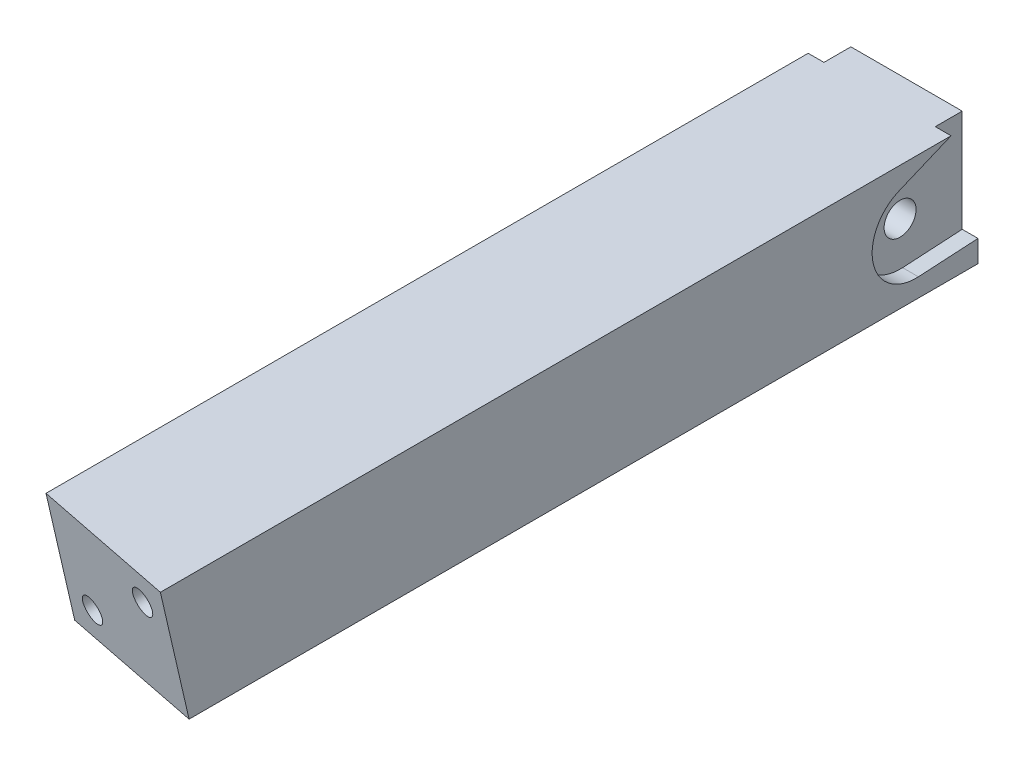
ISO-10303-21;
HEADER;
FILE_DESCRIPTION(('STEP AP214'),'2;1');
FILE_NAME('part.step','',(''),(''),'','','');
FILE_SCHEMA(('AUTOMOTIVE_DESIGN { 1 0 10303 214 1 1 1 1 }'));
ENDSEC;
DATA;
#1=APPLICATION_CONTEXT('core data for automotive mechanical design processes');
#2=APPLICATION_PROTOCOL_DEFINITION('international standard','automotive_design',2000,#1);
#3=PRODUCT_CONTEXT('',#1,'mechanical');
#4=PRODUCT('Part','Part','',(#3));
#5=PRODUCT_RELATED_PRODUCT_CATEGORY('part','',(#4));
#6=PRODUCT_DEFINITION_FORMATION('','',#4);
#7=PRODUCT_DEFINITION_CONTEXT('part definition',#1,'design');
#8=PRODUCT_DEFINITION('design','',#6,#7);
#9=PRODUCT_DEFINITION_SHAPE('','',#8);
#10=(LENGTH_UNIT() NAMED_UNIT(*) SI_UNIT(.MILLI.,.METRE.));
#11=(NAMED_UNIT(*) PLANE_ANGLE_UNIT() SI_UNIT($,.RADIAN.));
#12=(NAMED_UNIT(*) SI_UNIT($,.STERADIAN.) SOLID_ANGLE_UNIT());
#13=UNCERTAINTY_MEASURE_WITH_UNIT(LENGTH_MEASURE(1.E-05),#10,'distance_accuracy_value','');
#14=(GEOMETRIC_REPRESENTATION_CONTEXT(3) GLOBAL_UNCERTAINTY_ASSIGNED_CONTEXT((#13)) GLOBAL_UNIT_ASSIGNED_CONTEXT((#10,
#11,#12)) REPRESENTATION_CONTEXT('',''));
#15=CARTESIAN_POINT('',(0.,0.,0.));
#16=DIRECTION('',(0.,0.,1.));
#17=DIRECTION('',(1.,0.,0.));
#18=AXIS2_PLACEMENT_3D('',#15,#16,#17);
#19=CARTESIAN_POINT('',(-14.605,-12.7,188.173587081889));
#20=DIRECTION('',(-1.,0.,0.));
#21=DIRECTION('',(0.,0.,-1.));
#22=AXIS2_PLACEMENT_3D('',#19,#20,#21);
#23=PLANE('',#22);
#24=CARTESIAN_POINT('',(-14.605,0.,0.));
#25=DIRECTION('',(1.,0.,0.));
#26=DIRECTION('',(0.,0.,-1.));
#27=AXIS2_PLACEMENT_3D('',#24,#25,#26);
#28=CIRCLE('',#27,8.9408);
#29=CARTESIAN_POINT('',(-14.605,8.24835061759198,3.45001691724403));
#30=VERTEX_POINT('',#29);
#31=CARTESIAN_POINT('',(-14.605,-8.92595629933371,-0.51498425450186));
#32=VERTEX_POINT('',#31);
#33=EDGE_CURVE('E137',#30,#32,#28,.T.);
#34=ORIENTED_EDGE('',*,*,#33,.T.);
#35=DIRECTION('',(0.,0.0575993484365894,-0.998339779363559));
#36=VECTOR('',#35,1.);
#37=CARTESIAN_POINT('',(-14.605,-19.7887723133867,187.764599405642));
#38=LINE('',#37,#36);
#39=CARTESIAN_POINT('',(-14.605,-8.22294016981746,-12.7));
#40=VERTEX_POINT('',#39);
#41=EDGE_CURVE('E239',#32,#40,#38,.T.);
#42=ORIENTED_EDGE('',*,*,#41,.T.);
#43=DIRECTION('',(0.,-1.,0.));
#44=VECTOR('',#43,1.);
#45=CARTESIAN_POINT('',(-14.605,-12.7,-12.7));
#46=LINE('',#45,#44);
#47=CARTESIAN_POINT('',(-14.605,-12.7,-12.7));
#48=VERTEX_POINT('',#47);
#49=EDGE_CURVE('E202',#40,#48,#46,.T.);
#50=ORIENTED_EDGE('',*,*,#49,.T.);
#51=DIRECTION('',(0.,0.,-1.));
#52=VECTOR('',#51,1.);
#53=CARTESIAN_POINT('',(-14.605,-12.7,188.173587081889));
#54=LINE('',#53,#52);
#55=CARTESIAN_POINT('',(-14.605,-12.7,142.734728784824));
#56=VERTEX_POINT('',#55);
#57=EDGE_CURVE('E217',#56,#48,#54,.T.);
#58=ORIENTED_EDGE('',*,*,#57,.F.);
#59=DIRECTION('',(0.,-0.974345757792195,-0.225056313558081));
#60=VECTOR('',#59,1.);
#61=CARTESIAN_POINT('',(-14.605,-2.73604608624946,145.036222600913));
#62=LINE('',#61,#60);
#63=CARTESIAN_POINT('',(-14.605,12.7,148.601671108592));
#64=VERTEX_POINT('',#63);
#65=EDGE_CURVE('E218',#64,#56,#62,.T.);
#66=ORIENTED_EDGE('',*,*,#65,.F.);
#67=DIRECTION('',(0.,0.,-1.));
#68=VECTOR('',#67,1.);
#69=CARTESIAN_POINT('',(-14.605,12.7,188.173587081889));
#70=LINE('',#69,#68);
#71=CARTESIAN_POINT('',(-14.605,12.7,-7.19305116429456));
#72=VERTEX_POINT('',#71);
#73=EDGE_CURVE('E209',#64,#72,#70,.T.);
#74=ORIENTED_EDGE('',*,*,#73,.T.);
#75=DIRECTION('',(0.,0.385873402519241,-0.922551742304042));
#76=VECTOR('',#75,1.);
#77=CARTESIAN_POINT('',(-14.605,-60.6302303258765,168.125929903131));
#78=LINE('',#77,#76);
#79=EDGE_CURVE('E49',#30,#72,#78,.T.);
#80=ORIENTED_EDGE('',*,*,#79,.F.);
#81=EDGE_LOOP('',(#34,#42,#50,#58,#66,#74,#80));
#82=FACE_BOUND('',#81,.T.);
#83=ADVANCED_FACE('F41',(#82),#23,.T.);
#84=CARTESIAN_POINT('',(14.605,-12.7,188.173587081889));
#85=DIRECTION('',(1.,0.,0.));
#86=DIRECTION('',(0.,0.,1.));
#87=AXIS2_PLACEMENT_3D('',#84,#85,#86);
#88=PLANE('',#87);
#89=DIRECTION('',(0.,0.385873402519241,-0.922551742304042));
#90=VECTOR('',#89,1.);
#91=CARTESIAN_POINT('',(14.605,-60.6302303258765,168.125929903131));
#92=LINE('',#91,#90);
#93=CARTESIAN_POINT('',(14.605,8.24835061759198,3.45001691724403));
#94=VERTEX_POINT('',#93);
#95=CARTESIAN_POINT('',(14.605,12.7,-7.19305116429456));
#96=VERTEX_POINT('',#95);
#97=EDGE_CURVE('E236',#94,#96,#92,.T.);
#98=ORIENTED_EDGE('',*,*,#97,.T.);
#99=DIRECTION('',(0.,0.,-1.));
#100=VECTOR('',#99,1.);
#101=CARTESIAN_POINT('',(14.605,12.7,188.173587081889));
#102=LINE('',#101,#100);
#103=CARTESIAN_POINT('',(14.605,12.7,154.431187167313));
#104=VERTEX_POINT('',#103);
#105=EDGE_CURVE('E213',#104,#96,#102,.T.);
#106=ORIENTED_EDGE('',*,*,#105,.F.);
#107=DIRECTION('',(0.,0.974345757792195,0.225056313558081));
#108=VECTOR('',#107,1.);
#109=CARTESIAN_POINT('',(14.605,-4.0143578996497,150.570471664318));
#110=LINE('',#109,#108);
#111=CARTESIAN_POINT('',(14.605,-12.7,148.564244843544));
#112=VERTEX_POINT('',#111);
#113=EDGE_CURVE('E210',#112,#104,#110,.T.);
#114=ORIENTED_EDGE('',*,*,#113,.F.);
#115=DIRECTION('',(0.,0.,-1.));
#116=VECTOR('',#115,1.);
#117=CARTESIAN_POINT('',(14.605,-12.7,188.173587081889));
#118=LINE('',#117,#116);
#119=CARTESIAN_POINT('',(14.605,-12.7,-12.7));
#120=VERTEX_POINT('',#119);
#121=EDGE_CURVE('E214',#112,#120,#118,.T.);
#122=ORIENTED_EDGE('',*,*,#121,.T.);
#123=DIRECTION('',(0.,1.,0.));
#124=VECTOR('',#123,1.);
#125=CARTESIAN_POINT('',(14.605,-12.7,-12.7));
#126=LINE('',#125,#124);
#127=CARTESIAN_POINT('',(14.605,-8.22294016981746,-12.7));
#128=VERTEX_POINT('',#127);
#129=EDGE_CURVE('E189',#120,#128,#126,.T.);
#130=ORIENTED_EDGE('',*,*,#129,.T.);
#131=DIRECTION('',(0.,0.0575993484365893,-0.998339779363559));
#132=VECTOR('',#131,1.);
#133=CARTESIAN_POINT('',(14.605,-19.7887723133867,187.764599405642));
#134=LINE('',#133,#132);
#135=CARTESIAN_POINT('',(14.605,-8.92595629933371,-0.514984254501856));
#136=VERTEX_POINT('',#135);
#137=EDGE_CURVE('E180',#136,#128,#134,.T.);
#138=ORIENTED_EDGE('',*,*,#137,.F.);
#139=CARTESIAN_POINT('',(14.605,0.,0.));
#140=DIRECTION('',(-1.,0.,0.));
#141=DIRECTION('',(0.,0.,1.));
#142=AXIS2_PLACEMENT_3D('',#139,#140,#141);
#143=CIRCLE('',#142,8.9408);
#144=EDGE_CURVE('E233',#94,#136,#143,.F.);
#145=ORIENTED_EDGE('',*,*,#144,.F.);
#146=EDGE_LOOP('',(#98,#106,#114,#122,#130,#138,#145));
#147=FACE_BOUND('',#146,.T.);
#148=ADVANCED_FACE('F263',(#147),#88,.T.);
#149=CARTESIAN_POINT('',(0.,0.,-12.7));
#150=DIRECTION('',(0.,0.,1.));
#151=DIRECTION('',(-1.,0.,0.));
#152=AXIS2_PLACEMENT_3D('',#149,#150,#151);
#153=PLANE('',#152);
#154=DIRECTION('',(-1.,0.,0.));
#155=VECTOR('',#154,1.);
#156=CARTESIAN_POINT('',(-14.605,12.7,-12.7));
#157=LINE('',#156,#155);
#158=CARTESIAN_POINT('',(11.3792,12.7,-12.7));
#159=VERTEX_POINT('',#158);
#160=CARTESIAN_POINT('',(-11.3792,12.7,-12.7));
#161=VERTEX_POINT('',#160);
#162=EDGE_CURVE('E200',#159,#161,#157,.T.);
#163=ORIENTED_EDGE('',*,*,#162,.F.);
#164=DIRECTION('',(0.,-1.,0.));
#165=VECTOR('',#164,1.);
#166=CARTESIAN_POINT('',(11.3792,0.,-12.7));
#167=LINE('',#166,#165);
#168=CARTESIAN_POINT('',(11.3792,-8.22294016981746,-12.7));
#169=VERTEX_POINT('',#168);
#170=EDGE_CURVE('E176',#159,#169,#167,.T.);
#171=ORIENTED_EDGE('',*,*,#170,.T.);
#172=DIRECTION('',(1.,0.,0.));
#173=VECTOR('',#172,1.);
#174=CARTESIAN_POINT('',(0.,-8.22294016981746,-12.7));
#175=LINE('',#174,#173);
#176=EDGE_CURVE('E229',#169,#128,#175,.T.);
#177=ORIENTED_EDGE('',*,*,#176,.T.);
#178=ORIENTED_EDGE('',*,*,#129,.F.);
#179=DIRECTION('',(1.,0.,0.));
#180=VECTOR('',#179,1.);
#181=CARTESIAN_POINT('',(-14.605,-12.7,-12.7));
#182=LINE('',#181,#180);
#183=EDGE_CURVE('E205',#48,#120,#182,.T.);
#184=ORIENTED_EDGE('',*,*,#183,.F.);
#185=ORIENTED_EDGE('',*,*,#49,.F.);
#186=DIRECTION('',(-1.,0.,0.));
#187=VECTOR('',#186,1.);
#188=CARTESIAN_POINT('',(0.,-8.22294016981746,-12.7));
#189=LINE('',#188,#187);
#190=CARTESIAN_POINT('',(-11.3792,-8.22294016981746,-12.7));
#191=VERTEX_POINT('',#190);
#192=EDGE_CURVE('E156',#191,#40,#189,.T.);
#193=ORIENTED_EDGE('',*,*,#192,.F.);
#194=DIRECTION('',(0.,-1.,0.));
#195=VECTOR('',#194,1.);
#196=CARTESIAN_POINT('',(-11.3792,0.,-12.7));
#197=LINE('',#196,#195);
#198=EDGE_CURVE('E159',#161,#191,#197,.T.);
#199=ORIENTED_EDGE('',*,*,#198,.F.);
#200=EDGE_LOOP('',(#163,#171,#177,#178,#184,#185,#193,#199));
#201=FACE_BOUND('',#200,.T.);
#202=ADVANCED_FACE('F251',(#201),#153,.F.);
#203=CARTESIAN_POINT('',(-14.605,0.,0.));
#204=DIRECTION('',(1.,0.,0.));
#205=DIRECTION('',(0.,0.,1.));
#206=AXIS2_PLACEMENT_3D('',#203,#204,#205);
#207=CYLINDRICAL_SURFACE('',#206,3.2639);
#208=CARTESIAN_POINT('',(-11.3792,0.,0.));
#209=DIRECTION('',(-1.,0.,0.));
#210=DIRECTION('',(0.,0.,1.));
#211=AXIS2_PLACEMENT_3D('',#208,#209,#210);
#212=CIRCLE('',#211,3.2639);
#213=CARTESIAN_POINT('',(-11.3792,0.,3.2639));
#214=VERTEX_POINT('',#213);
#215=EDGE_CURVE('E161',#214,#214,#212,.F.);
#216=ORIENTED_EDGE('',*,*,#215,.F.);
#217=EDGE_LOOP('',(#216));
#218=FACE_BOUND('',#217,.T.);
#219=CARTESIAN_POINT('',(11.3792,0.,0.));
#220=DIRECTION('',(-1.,0.,0.));
#221=DIRECTION('',(0.,0.,1.));
#222=AXIS2_PLACEMENT_3D('',#219,#220,#221);
#223=CIRCLE('',#222,3.2639);
#224=CARTESIAN_POINT('',(11.3792,0.,3.2639));
#225=VERTEX_POINT('',#224);
#226=EDGE_CURVE('E170',#225,#225,#223,.F.);
#227=ORIENTED_EDGE('',*,*,#226,.T.);
#228=EDGE_LOOP('',(#227));
#229=FACE_BOUND('',#228,.T.);
#230=ADVANCED_FACE('F303',(#218,#229),#207,.F.);
#231=CARTESIAN_POINT('',(-362.881468767956,-840.395664617597,-117.954501012968));
#232=DIRECTION('',(-0.190877495960602,-0.220918397975017,0.956431305934704));
#233=DIRECTION('',(0.,0.974345757792195,0.225056313558081));
#234=AXIS2_PLACEMENT_3D('',#231,#232,#233);
#235=PLANE('',#234);
#236=CARTESIAN_POINT('',(-8.22450987228349,-6.36060008000148,145.472387032501));
#237=DIRECTION('',(0.190877495960602,0.220918397975017,-0.956431305934704));
#238=DIRECTION('',(0.,0.974345757792195,0.225056313558081));
#239=AXIS2_PLACEMENT_3D('',#236,#237,#238);
#240=CIRCLE('',#239,2.52730000000012);
#241=CARTESIAN_POINT('',(-8.22450987228349,-3.89813604633315,146.041171853757));
#242=VERTEX_POINT('',#241);
#243=EDGE_CURVE('E190',#242,#242,#240,.T.);
#244=ORIENTED_EDGE('',*,*,#243,.T.);
#245=EDGE_LOOP('',(#244));
#246=FACE_BOUND('',#245,.T.);
#247=CARTESIAN_POINT('',(8.22450987228347,6.36060008000145,151.693528919635));
#248=DIRECTION('',(0.190877495960602,0.220918397975017,-0.956431305934704));
#249=DIRECTION('',(0.,0.974345757792195,0.225056313558081));
#250=AXIS2_PLACEMENT_3D('',#247,#248,#249);
#251=CIRCLE('',#250,2.52730000000013);
#252=CARTESIAN_POINT('',(8.22450987228347,8.82306411366979,152.262313740891));
#253=VERTEX_POINT('',#252);
#254=EDGE_CURVE('E193',#253,#253,#251,.T.);
#255=ORIENTED_EDGE('',*,*,#254,.T.);
#256=EDGE_LOOP('',(#255));
#257=FACE_BOUND('',#256,.T.);
#258=ORIENTED_EDGE('',*,*,#113,.T.);
#259=DIRECTION('',(-0.980661193019829,0.,-0.195713117866241));
#260=VECTOR('',#259,1.);
#261=CARTESIAN_POINT('',(-7.01003103597834,12.7,150.117418918974));
#262=LINE('',#261,#260);
#263=EDGE_CURVE('E207',#104,#64,#262,.T.);
#264=ORIENTED_EDGE('',*,*,#263,.T.);
#265=ORIENTED_EDGE('',*,*,#65,.T.);
#266=DIRECTION('',(0.980661193019829,0.,0.195713117866241));
#267=VECTOR('',#266,1.);
#268=CARTESIAN_POINT('',(-5.88399900627334,-12.7,144.475201750967));
#269=LINE('',#268,#267);
#270=EDGE_CURVE('E215',#56,#112,#269,.T.);
#271=ORIENTED_EDGE('',*,*,#270,.T.);
#272=EDGE_LOOP('',(#258,#264,#265,#271));
#273=FACE_BOUND('',#272,.T.);
#274=ADVANCED_FACE('F43',(#246,#257,#273),#235,.T.);
#275=CARTESIAN_POINT('',(-14.605,12.7,188.173587081889));
#276=DIRECTION('',(0.,1.,0.));
#277=DIRECTION('',(0.,0.,-1.));
#278=AXIS2_PLACEMENT_3D('',#275,#276,#277);
#279=PLANE('',#278);
#280=DIRECTION('',(0.,0.,1.));
#281=VECTOR('',#280,1.);
#282=CARTESIAN_POINT('',(-11.3792,12.7,188.173587081889));
#283=LINE('',#282,#281);
#284=CARTESIAN_POINT('',(-11.3792,12.7,-7.19305116429456));
#285=VERTEX_POINT('',#284);
#286=EDGE_CURVE('E11',#161,#285,#283,.T.);
#287=ORIENTED_EDGE('',*,*,#286,.T.);
#288=DIRECTION('',(1.,0.,0.));
#289=VECTOR('',#288,1.);
#290=CARTESIAN_POINT('',(-14.605,12.7,-7.19305116429456));
#291=LINE('',#290,#289);
#292=EDGE_CURVE('E145',#72,#285,#291,.T.);
#293=ORIENTED_EDGE('',*,*,#292,.F.);
#294=ORIENTED_EDGE('',*,*,#73,.F.);
#295=ORIENTED_EDGE('',*,*,#263,.F.);
#296=ORIENTED_EDGE('',*,*,#105,.T.);
#297=DIRECTION('',(-1.,0.,0.));
#298=VECTOR('',#297,1.);
#299=CARTESIAN_POINT('',(-14.605,12.7,-7.19305116429458));
#300=LINE('',#299,#298);
#301=CARTESIAN_POINT('',(11.3792,12.7,-7.19305116429462));
#302=VERTEX_POINT('',#301);
#303=EDGE_CURVE('E183',#96,#302,#300,.T.);
#304=ORIENTED_EDGE('',*,*,#303,.T.);
#305=DIRECTION('',(0.,0.,1.));
#306=VECTOR('',#305,1.);
#307=CARTESIAN_POINT('',(11.3792,12.7,188.173587081889));
#308=LINE('',#307,#306);
#309=EDGE_CURVE('E64',#159,#302,#308,.T.);
#310=ORIENTED_EDGE('',*,*,#309,.F.);
#311=ORIENTED_EDGE('',*,*,#162,.T.);
#312=EDGE_LOOP('',(#287,#293,#294,#295,#296,#304,#310,#311));
#313=FACE_BOUND('',#312,.T.);
#314=ADVANCED_FACE('F246',(#313),#279,.T.);
#315=CARTESIAN_POINT('',(-14.605,-12.7,188.173587081889));
#316=DIRECTION('',(0.,-1.,0.));
#317=DIRECTION('',(0.,0.,1.));
#318=AXIS2_PLACEMENT_3D('',#315,#316,#317);
#319=PLANE('',#318);
#320=ORIENTED_EDGE('',*,*,#57,.T.);
#321=ORIENTED_EDGE('',*,*,#183,.T.);
#322=ORIENTED_EDGE('',*,*,#121,.F.);
#323=ORIENTED_EDGE('',*,*,#270,.F.);
#324=EDGE_LOOP('',(#320,#321,#322,#323));
#325=FACE_BOUND('',#324,.T.);
#326=ADVANCED_FACE('F256',(#325),#319,.T.);
#327=CARTESIAN_POINT('',(11.254690120658,9.86767964785485,136.510181937922));
#328=DIRECTION('',(-0.190877495960602,-0.220918397975017,0.956431305934703));
#329=DIRECTION('',(0.,0.974345757792195,0.225056313558081));
#330=AXIS2_PLACEMENT_3D('',#327,#328,#329);
#331=CYLINDRICAL_SURFACE('',#330,2.52730000000013);
#332=CARTESIAN_POINT('',(11.254690120658,9.86767964785485,136.510181937922));
#333=DIRECTION('',(0.190877495960602,0.220918397975017,-0.956431305934704));
#334=DIRECTION('',(0.,0.974345757792195,0.225056313558081));
#335=AXIS2_PLACEMENT_3D('',#332,#333,#334);
#336=CIRCLE('',#335,2.52730000000013);
#337=CARTESIAN_POINT('',(11.254690120658,12.3301436815232,137.078966759177));
#338=VERTEX_POINT('',#337);
#339=EDGE_CURVE('E185',#338,#338,#336,.T.);
#340=ORIENTED_EDGE('',*,*,#339,.T.);
#341=EDGE_LOOP('',(#340));
#342=FACE_BOUND('',#341,.T.);
#343=ORIENTED_EDGE('',*,*,#254,.F.);
#344=EDGE_LOOP('',(#343));
#345=FACE_BOUND('',#344,.T.);
#346=ADVANCED_FACE('F302',(#342,#345),#331,.F.);
#347=CARTESIAN_POINT('',(11.254690120658,9.86767964785485,136.510181937922));
#348=DIRECTION('',(-0.190877495960602,-0.220918397975017,0.956431305934704));
#349=DIRECTION('',(0.,0.974345757792195,0.225056313558081));
#350=AXIS2_PLACEMENT_3D('',#347,#348,#349);
#351=PLANE('',#350);
#352=ORIENTED_EDGE('',*,*,#339,.F.);
#353=EDGE_LOOP('',(#352));
#354=FACE_BOUND('',#353,.T.);
#355=ADVANCED_FACE('F314',(#354),#351,.T.);
#356=CARTESIAN_POINT('',(-5.19432962390894,-2.85352051214808,130.289040050788));
#357=DIRECTION('',(-0.190877495960602,-0.220918397975017,0.956431305934703));
#358=DIRECTION('',(0.,0.974345757792195,0.225056313558081));
#359=AXIS2_PLACEMENT_3D('',#356,#357,#358);
#360=CYLINDRICAL_SURFACE('',#359,2.52730000000012);
#361=CARTESIAN_POINT('',(-5.19432962390894,-2.85352051214808,130.289040050788));
#362=DIRECTION('',(0.190877495960602,0.220918397975017,-0.956431305934704));
#363=DIRECTION('',(0.,0.974345757792195,0.225056313558081));
#364=AXIS2_PLACEMENT_3D('',#361,#362,#363);
#365=CIRCLE('',#364,2.52730000000012);
#366=CARTESIAN_POINT('',(-5.19432962390894,-0.391056478479753,130.857824872043));
#367=VERTEX_POINT('',#366);
#368=EDGE_CURVE('E186',#367,#367,#365,.T.);
#369=ORIENTED_EDGE('',*,*,#368,.T.);
#370=EDGE_LOOP('',(#369));
#371=FACE_BOUND('',#370,.T.);
#372=ORIENTED_EDGE('',*,*,#243,.F.);
#373=EDGE_LOOP('',(#372));
#374=FACE_BOUND('',#373,.T.);
#375=ADVANCED_FACE('F320',(#371,#374),#360,.F.);
#376=CARTESIAN_POINT('',(-5.19432962390894,-2.85352051214808,130.289040050788));
#377=DIRECTION('',(-0.190877495960602,-0.220918397975017,0.956431305934704));
#378=DIRECTION('',(0.,0.974345757792195,0.225056313558081));
#379=AXIS2_PLACEMENT_3D('',#376,#377,#378);
#380=PLANE('',#379);
#381=ORIENTED_EDGE('',*,*,#368,.F.);
#382=EDGE_LOOP('',(#381));
#383=FACE_BOUND('',#382,.T.);
#384=ADVANCED_FACE('F371',(#383),#380,.T.);
#385=CARTESIAN_POINT('',(11.3792,0.,0.));
#386=DIRECTION('',(1.,0.,0.));
#387=DIRECTION('',(0.,-0.224951054343866,0.974370064785235));
#388=AXIS2_PLACEMENT_3D('',#385,#386,#387);
#389=PLANE('',#388);
#390=ORIENTED_EDGE('',*,*,#170,.F.);
#391=ORIENTED_EDGE('',*,*,#309,.T.);
#392=DIRECTION('',(0.,0.385873402519241,-0.922551742304042));
#393=VECTOR('',#392,1.);
#394=CARTESIAN_POINT('',(11.3792,8.24835061759197,3.45001691724403));
#395=LINE('',#394,#393);
#396=CARTESIAN_POINT('',(11.3792,8.24835061759198,3.45001691724403));
#397=VERTEX_POINT('',#396);
#398=EDGE_CURVE('E168',#397,#302,#395,.T.);
#399=ORIENTED_EDGE('',*,*,#398,.F.);
#400=CARTESIAN_POINT('',(11.3792,0.,0.));
#401=DIRECTION('',(-1.,0.,0.));
#402=DIRECTION('',(0.,0.,1.));
#403=AXIS2_PLACEMENT_3D('',#400,#401,#402);
#404=CIRCLE('',#403,8.9408);
#405=CARTESIAN_POINT('',(11.3792,-8.92595629933371,-0.514984254501856));
#406=VERTEX_POINT('',#405);
#407=EDGE_CURVE('E164',#397,#406,#404,.F.);
#408=ORIENTED_EDGE('',*,*,#407,.T.);
#409=DIRECTION('',(0.,0.0575993484365893,-0.998339779363559));
#410=VECTOR('',#409,1.);
#411=CARTESIAN_POINT('',(11.3792,-8.92595629933371,-0.514984254501858));
#412=LINE('',#411,#410);
#413=EDGE_CURVE('E167',#406,#169,#412,.T.);
#414=ORIENTED_EDGE('',*,*,#413,.T.);
#415=EDGE_LOOP('',(#390,#391,#399,#408,#414));
#416=FACE_BOUND('',#415,.T.);
#417=ORIENTED_EDGE('',*,*,#226,.F.);
#418=EDGE_LOOP('',(#417));
#419=FACE_BOUND('',#418,.T.);
#420=ADVANCED_FACE('F271',(#416,#419),#389,.T.);
#421=CARTESIAN_POINT('',(14.605,8.24835061759198,3.45001691724403));
#422=DIRECTION('',(0.,0.922551742304042,0.385873402519241));
#423=DIRECTION('',(0.,-0.385873402519241,0.922551742304042));
#424=AXIS2_PLACEMENT_3D('',#421,#422,#423);
#425=PLANE('',#424);
#426=ORIENTED_EDGE('',*,*,#303,.F.);
#427=ORIENTED_EDGE('',*,*,#97,.F.);
#428=DIRECTION('',(-1.,0.,0.));
#429=VECTOR('',#428,1.);
#430=CARTESIAN_POINT('',(14.605,8.24835061759198,3.45001691724403));
#431=LINE('',#430,#429);
#432=EDGE_CURVE('E165',#94,#397,#431,.T.);
#433=ORIENTED_EDGE('',*,*,#432,.T.);
#434=ORIENTED_EDGE('',*,*,#398,.T.);
#435=EDGE_LOOP('',(#426,#427,#433,#434));
#436=FACE_BOUND('',#435,.T.);
#437=ADVANCED_FACE('F267',(#436),#425,.F.);
#438=CARTESIAN_POINT('',(14.605,-8.92595629933371,-0.514984254501858));
#439=DIRECTION('',(0.,0.998339779363559,0.0575993484365893));
#440=DIRECTION('',(0.,-0.0575993484365893,0.998339779363559));
#441=AXIS2_PLACEMENT_3D('',#438,#439,#440);
#442=PLANE('',#441);
#443=DIRECTION('',(-1.,0.,0.));
#444=VECTOR('',#443,1.);
#445=CARTESIAN_POINT('',(14.605,-8.92595629933371,-0.514984254501856));
#446=LINE('',#445,#444);
#447=EDGE_CURVE('E171',#136,#406,#446,.T.);
#448=ORIENTED_EDGE('',*,*,#447,.F.);
#449=ORIENTED_EDGE('',*,*,#137,.T.);
#450=ORIENTED_EDGE('',*,*,#176,.F.);
#451=ORIENTED_EDGE('',*,*,#413,.F.);
#452=EDGE_LOOP('',(#448,#449,#450,#451));
#453=FACE_BOUND('',#452,.T.);
#454=ADVANCED_FACE('F277',(#453),#442,.T.);
#455=CARTESIAN_POINT('',(14.605,0.,0.));
#456=DIRECTION('',(-1.,0.,0.));
#457=DIRECTION('',(0.,0.224951054343866,-0.974370064785235));
#458=AXIS2_PLACEMENT_3D('',#455,#456,#457);
#459=CYLINDRICAL_SURFACE('',#458,8.9408);
#460=ORIENTED_EDGE('',*,*,#432,.F.);
#461=ORIENTED_EDGE('',*,*,#144,.T.);
#462=ORIENTED_EDGE('',*,*,#447,.T.);
#463=ORIENTED_EDGE('',*,*,#407,.F.);
#464=EDGE_LOOP('',(#460,#461,#462,#463));
#465=FACE_BOUND('',#464,.T.);
#466=ADVANCED_FACE('F279',(#465),#459,.F.);
#467=CARTESIAN_POINT('',(-11.3792,0.,0.));
#468=DIRECTION('',(1.,0.,0.));
#469=DIRECTION('',(0.,-0.224951054343866,0.974370064785235));
#470=AXIS2_PLACEMENT_3D('',#467,#468,#469);
#471=PLANE('',#470);
#472=ORIENTED_EDGE('',*,*,#286,.F.);
#473=ORIENTED_EDGE('',*,*,#198,.T.);
#474=DIRECTION('',(0.,0.0575993484365894,-0.998339779363559));
#475=VECTOR('',#474,1.);
#476=CARTESIAN_POINT('',(-11.3792,-8.92595629933371,-0.514984254501858));
#477=LINE('',#476,#475);
#478=CARTESIAN_POINT('',(-11.3792,-8.92595629933371,-0.514984254501858));
#479=VERTEX_POINT('',#478);
#480=EDGE_CURVE('E151',#479,#191,#477,.T.);
#481=ORIENTED_EDGE('',*,*,#480,.F.);
#482=CARTESIAN_POINT('',(-11.3792,0.,0.));
#483=DIRECTION('',(-1.,0.,0.));
#484=DIRECTION('',(0.,0.,1.));
#485=AXIS2_PLACEMENT_3D('',#482,#483,#484);
#486=CIRCLE('',#485,8.9408);
#487=CARTESIAN_POINT('',(-11.3792,8.24835061759198,3.45001691724403));
#488=VERTEX_POINT('',#487);
#489=EDGE_CURVE('E134',#488,#479,#486,.F.);
#490=ORIENTED_EDGE('',*,*,#489,.F.);
#491=DIRECTION('',(0.,0.385873402519241,-0.922551742304042));
#492=VECTOR('',#491,1.);
#493=CARTESIAN_POINT('',(-11.3792,8.24835061759198,3.45001691724403));
#494=LINE('',#493,#492);
#495=EDGE_CURVE('E141',#488,#285,#494,.T.);
#496=ORIENTED_EDGE('',*,*,#495,.T.);
#497=EDGE_LOOP('',(#472,#473,#481,#490,#496));
#498=FACE_BOUND('',#497,.T.);
#499=ORIENTED_EDGE('',*,*,#215,.T.);
#500=EDGE_LOOP('',(#499));
#501=FACE_BOUND('',#500,.T.);
#502=ADVANCED_FACE('F148',(#498,#501),#471,.F.);
#503=CARTESIAN_POINT('',(-14.732,-8.92595629933371,-0.514984254501858));
#504=DIRECTION('',(0.,-0.998339779363559,-0.0575993484365894));
#505=DIRECTION('',(0.,0.0575993484365893,-0.998339779363559));
#506=AXIS2_PLACEMENT_3D('',#503,#504,#505);
#507=PLANE('',#506);
#508=ORIENTED_EDGE('',*,*,#480,.T.);
#509=ORIENTED_EDGE('',*,*,#192,.T.);
#510=ORIENTED_EDGE('',*,*,#41,.F.);
#511=DIRECTION('',(-1.,0.,0.));
#512=VECTOR('',#511,1.);
#513=CARTESIAN_POINT('',(-14.732,-8.92595629933371,-0.514984254501858));
#514=LINE('',#513,#512);
#515=EDGE_CURVE('E56',#32,#479,#514,.F.);
#516=ORIENTED_EDGE('',*,*,#515,.T.);
#517=EDGE_LOOP('',(#508,#509,#510,#516));
#518=FACE_BOUND('',#517,.T.);
#519=ADVANCED_FACE('F254',(#518),#507,.F.);
#520=CARTESIAN_POINT('',(-14.732,8.24835061759198,3.45001691724403));
#521=DIRECTION('',(0.,-0.922551742304042,-0.385873402519241));
#522=DIRECTION('',(0.,0.385873402519241,-0.922551742304042));
#523=AXIS2_PLACEMENT_3D('',#520,#521,#522);
#524=PLANE('',#523);
#525=ORIENTED_EDGE('',*,*,#79,.T.);
#526=ORIENTED_EDGE('',*,*,#292,.T.);
#527=ORIENTED_EDGE('',*,*,#495,.F.);
#528=DIRECTION('',(1.,0.,0.));
#529=VECTOR('',#528,1.);
#530=CARTESIAN_POINT('',(-14.732,8.24835061759198,3.45001691724403));
#531=LINE('',#530,#529);
#532=EDGE_CURVE('E130',#30,#488,#531,.T.);
#533=ORIENTED_EDGE('',*,*,#532,.F.);
#534=EDGE_LOOP('',(#525,#526,#527,#533));
#535=FACE_BOUND('',#534,.T.);
#536=ADVANCED_FACE('F144',(#535),#524,.T.);
#537=CARTESIAN_POINT('',(-14.732,0.,0.));
#538=DIRECTION('',(1.,0.,0.));
#539=DIRECTION('',(0.,-0.224951054343866,0.974370064785235));
#540=AXIS2_PLACEMENT_3D('',#537,#538,#539);
#541=CYLINDRICAL_SURFACE('',#540,8.9408);
#542=ORIENTED_EDGE('',*,*,#33,.F.);
#543=ORIENTED_EDGE('',*,*,#532,.T.);
#544=ORIENTED_EDGE('',*,*,#489,.T.);
#545=ORIENTED_EDGE('',*,*,#515,.F.);
#546=EDGE_LOOP('',(#542,#543,#544,#545));
#547=FACE_BOUND('',#546,.T.);
#548=ADVANCED_FACE('F132',(#547),#541,.F.);
#549=CLOSED_SHELL('',(#83,#148,#202,#230,#274,#314,#326,#346,#355,#375,#384,#420,#437,#454,#466,
#502,#519,#536,#548));
#550=MANIFOLD_SOLID_BREP('B2',#549);
#551=ADVANCED_BREP_SHAPE_REPRESENTATION('',(#18,#550),#14);
#552=SHAPE_DEFINITION_REPRESENTATION(#9,#551);
ENDSEC;
END-ISO-10303-21;
